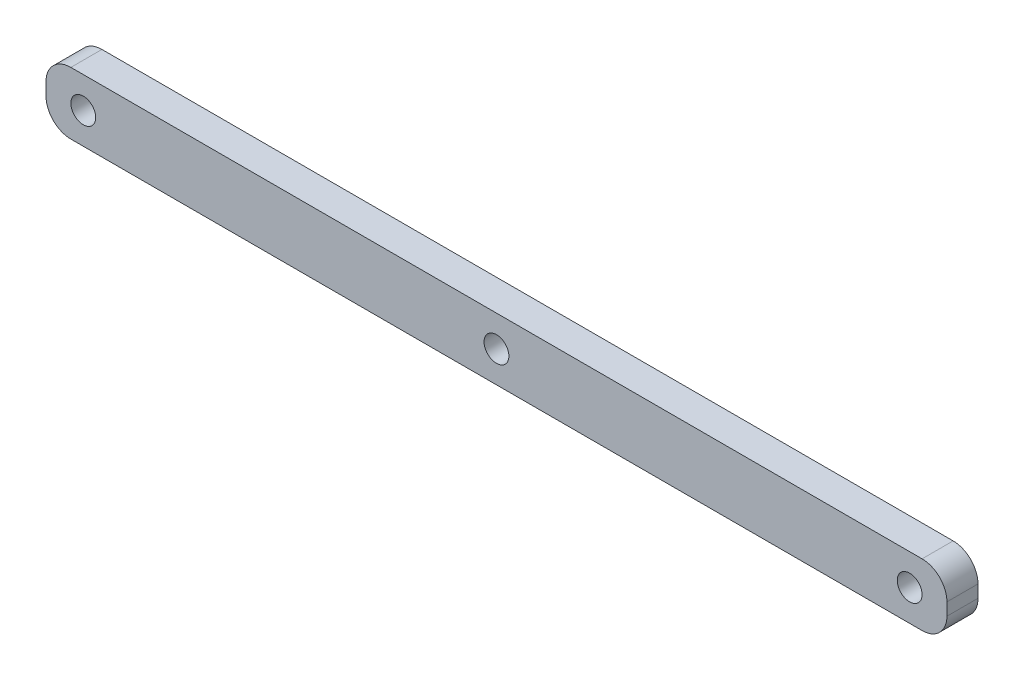
ISO-10303-21;
HEADER;
FILE_DESCRIPTION(('STEP AP214'),'2;1');
FILE_NAME('part.step','',(''),(''),'','','');
FILE_SCHEMA(('AUTOMOTIVE_DESIGN { 1 0 10303 214 1 1 1 1 }'));
ENDSEC;
DATA;
#1=APPLICATION_CONTEXT('core data for automotive mechanical design processes');
#2=APPLICATION_PROTOCOL_DEFINITION('international standard','automotive_design',2000,#1);
#3=PRODUCT_CONTEXT('',#1,'mechanical');
#4=PRODUCT('Part','Part','',(#3));
#5=PRODUCT_RELATED_PRODUCT_CATEGORY('part','',(#4));
#6=PRODUCT_DEFINITION_FORMATION('','',#4);
#7=PRODUCT_DEFINITION_CONTEXT('part definition',#1,'design');
#8=PRODUCT_DEFINITION('design','',#6,#7);
#9=PRODUCT_DEFINITION_SHAPE('','',#8);
#10=(LENGTH_UNIT() NAMED_UNIT(*) SI_UNIT(.MILLI.,.METRE.));
#11=(NAMED_UNIT(*) PLANE_ANGLE_UNIT() SI_UNIT($,.RADIAN.));
#12=(NAMED_UNIT(*) SI_UNIT($,.STERADIAN.) SOLID_ANGLE_UNIT());
#13=UNCERTAINTY_MEASURE_WITH_UNIT(LENGTH_MEASURE(1.E-05),#10,'distance_accuracy_value','');
#14=(GEOMETRIC_REPRESENTATION_CONTEXT(3) GLOBAL_UNCERTAINTY_ASSIGNED_CONTEXT((#13)) GLOBAL_UNIT_ASSIGNED_CONTEXT((#10,
#11,#12)) REPRESENTATION_CONTEXT('',''));
#15=CARTESIAN_POINT('',(0.,0.,0.));
#16=DIRECTION('',(0.,0.,1.));
#17=DIRECTION('',(1.,0.,0.));
#18=AXIS2_PLACEMENT_3D('',#15,#16,#17);
#19=CARTESIAN_POINT('',(72.5,5.,5.));
#20=DIRECTION('',(-1.,0.,0.));
#21=DIRECTION('',(0.,0.,1.));
#22=AXIS2_PLACEMENT_3D('',#19,#20,#21);
#23=PLANE('',#22);
#24=DIRECTION('',(0.,1.,0.));
#25=VECTOR('',#24,1.);
#26=CARTESIAN_POINT('',(72.5,5.,0.));
#27=LINE('',#26,#25);
#28=CARTESIAN_POINT('',(72.5,-1.,0.));
#29=VERTEX_POINT('',#28);
#30=CARTESIAN_POINT('',(72.5,1.,0.));
#31=VERTEX_POINT('',#30);
#32=EDGE_CURVE('E181',#29,#31,#27,.T.);
#33=ORIENTED_EDGE('',*,*,#32,.T.);
#34=DIRECTION('',(0.,0.,-1.));
#35=VECTOR('',#34,1.);
#36=CARTESIAN_POINT('',(72.5,1.,5.));
#37=LINE('',#36,#35);
#38=CARTESIAN_POINT('',(72.5,1.,5.));
#39=VERTEX_POINT('',#38);
#40=EDGE_CURVE('E11',#31,#39,#37,.F.);
#41=ORIENTED_EDGE('',*,*,#40,.T.);
#42=DIRECTION('',(0.,1.,0.));
#43=VECTOR('',#42,1.);
#44=CARTESIAN_POINT('',(72.5,5.,5.));
#45=LINE('',#44,#43);
#46=CARTESIAN_POINT('',(72.5,-1.,5.));
#47=VERTEX_POINT('',#46);
#48=EDGE_CURVE('E142',#47,#39,#45,.T.);
#49=ORIENTED_EDGE('',*,*,#48,.F.);
#50=DIRECTION('',(0.,0.,-1.));
#51=VECTOR('',#50,1.);
#52=CARTESIAN_POINT('',(72.5,-1.,5.));
#53=LINE('',#52,#51);
#54=EDGE_CURVE('E47',#47,#29,#53,.T.);
#55=ORIENTED_EDGE('',*,*,#54,.T.);
#56=EDGE_LOOP('',(#33,#41,#49,#55));
#57=FACE_BOUND('',#56,.T.);
#58=ADVANCED_FACE('F39',(#57),#23,.F.);
#59=CARTESIAN_POINT('',(-72.5,5.,5.));
#60=DIRECTION('',(0.,-1.,0.));
#61=DIRECTION('',(0.,0.,-1.));
#62=AXIS2_PLACEMENT_3D('',#59,#60,#61);
#63=PLANE('',#62);
#64=DIRECTION('',(-1.,0.,0.));
#65=VECTOR('',#64,1.);
#66=CARTESIAN_POINT('',(-72.5,5.,0.));
#67=LINE('',#66,#65);
#68=CARTESIAN_POINT('',(68.5,5.,0.));
#69=VERTEX_POINT('',#68);
#70=CARTESIAN_POINT('',(-68.5,5.,0.));
#71=VERTEX_POINT('',#70);
#72=EDGE_CURVE('E148',#69,#71,#67,.T.);
#73=ORIENTED_EDGE('',*,*,#72,.T.);
#74=DIRECTION('',(0.,0.,-1.));
#75=VECTOR('',#74,1.);
#76=CARTESIAN_POINT('',(-68.5,5.,5.));
#77=LINE('',#76,#75);
#78=CARTESIAN_POINT('',(-68.5,5.,5.));
#79=VERTEX_POINT('',#78);
#80=EDGE_CURVE('E57',#71,#79,#77,.F.);
#81=ORIENTED_EDGE('',*,*,#80,.T.);
#82=DIRECTION('',(-1.,0.,0.));
#83=VECTOR('',#82,1.);
#84=CARTESIAN_POINT('',(-72.5,5.,5.));
#85=LINE('',#84,#83);
#86=CARTESIAN_POINT('',(68.5,5.,5.));
#87=VERTEX_POINT('',#86);
#88=EDGE_CURVE('E145',#87,#79,#85,.T.);
#89=ORIENTED_EDGE('',*,*,#88,.F.);
#90=DIRECTION('',(0.,0.,-1.));
#91=VECTOR('',#90,1.);
#92=CARTESIAN_POINT('',(68.5,5.,5.));
#93=LINE('',#92,#91);
#94=EDGE_CURVE('E172',#87,#69,#93,.T.);
#95=ORIENTED_EDGE('',*,*,#94,.T.);
#96=EDGE_LOOP('',(#73,#81,#89,#95));
#97=FACE_BOUND('',#96,.T.);
#98=ADVANCED_FACE('F234',(#97),#63,.F.);
#99=CARTESIAN_POINT('',(-72.5,5.,5.));
#100=DIRECTION('',(1.,0.,0.));
#101=DIRECTION('',(0.,0.,-1.));
#102=AXIS2_PLACEMENT_3D('',#99,#100,#101);
#103=PLANE('',#102);
#104=DIRECTION('',(0.,-1.,0.));
#105=VECTOR('',#104,1.);
#106=CARTESIAN_POINT('',(-72.5,5.,0.));
#107=LINE('',#106,#105);
#108=CARTESIAN_POINT('',(-72.5,1.,0.));
#109=VERTEX_POINT('',#108);
#110=CARTESIAN_POINT('',(-72.5,-1.,0.));
#111=VERTEX_POINT('',#110);
#112=EDGE_CURVE('E143',#109,#111,#107,.T.);
#113=ORIENTED_EDGE('',*,*,#112,.T.);
#114=DIRECTION('',(0.,0.,-1.));
#115=VECTOR('',#114,1.);
#116=CARTESIAN_POINT('',(-72.5,-1.,5.));
#117=LINE('',#116,#115);
#118=CARTESIAN_POINT('',(-72.5,-1.,5.));
#119=VERTEX_POINT('',#118);
#120=EDGE_CURVE('E118',#111,#119,#117,.F.);
#121=ORIENTED_EDGE('',*,*,#120,.T.);
#122=DIRECTION('',(0.,-1.,0.));
#123=VECTOR('',#122,1.);
#124=CARTESIAN_POINT('',(-72.5,5.,5.));
#125=LINE('',#124,#123);
#126=CARTESIAN_POINT('',(-72.5,1.,5.));
#127=VERTEX_POINT('',#126);
#128=EDGE_CURVE('E195',#127,#119,#125,.T.);
#129=ORIENTED_EDGE('',*,*,#128,.F.);
#130=DIRECTION('',(0.,0.,-1.));
#131=VECTOR('',#130,1.);
#132=CARTESIAN_POINT('',(-72.5,1.,5.));
#133=LINE('',#132,#131);
#134=EDGE_CURVE('E124',#127,#109,#133,.T.);
#135=ORIENTED_EDGE('',*,*,#134,.T.);
#136=EDGE_LOOP('',(#113,#121,#129,#135));
#137=FACE_BOUND('',#136,.T.);
#138=ADVANCED_FACE('F231',(#137),#103,.F.);
#139=CARTESIAN_POINT('',(-72.5,-5.,5.));
#140=DIRECTION('',(0.,1.,0.));
#141=DIRECTION('',(0.,0.,1.));
#142=AXIS2_PLACEMENT_3D('',#139,#140,#141);
#143=PLANE('',#142);
#144=DIRECTION('',(1.,0.,0.));
#145=VECTOR('',#144,1.);
#146=CARTESIAN_POINT('',(-72.5,-5.,5.));
#147=LINE('',#146,#145);
#148=CARTESIAN_POINT('',(-68.5,-5.,5.));
#149=VERTEX_POINT('',#148);
#150=CARTESIAN_POINT('',(68.5,-5.,5.));
#151=VERTEX_POINT('',#150);
#152=EDGE_CURVE('E134',#149,#151,#147,.T.);
#153=ORIENTED_EDGE('',*,*,#152,.F.);
#154=DIRECTION('',(0.,0.,-1.));
#155=VECTOR('',#154,1.);
#156=CARTESIAN_POINT('',(-68.5,-5.,5.));
#157=LINE('',#156,#155);
#158=CARTESIAN_POINT('',(-68.5,-5.,0.));
#159=VERTEX_POINT('',#158);
#160=EDGE_CURVE('E117',#149,#159,#157,.T.);
#161=ORIENTED_EDGE('',*,*,#160,.T.);
#162=DIRECTION('',(1.,0.,0.));
#163=VECTOR('',#162,1.);
#164=CARTESIAN_POINT('',(-72.5,-5.,0.));
#165=LINE('',#164,#163);
#166=CARTESIAN_POINT('',(68.5,-5.,0.));
#167=VERTEX_POINT('',#166);
#168=EDGE_CURVE('E131',#159,#167,#165,.T.);
#169=ORIENTED_EDGE('',*,*,#168,.T.);
#170=DIRECTION('',(0.,0.,-1.));
#171=VECTOR('',#170,1.);
#172=CARTESIAN_POINT('',(68.5,-5.,5.));
#173=LINE('',#172,#171);
#174=EDGE_CURVE('E137',#167,#151,#173,.F.);
#175=ORIENTED_EDGE('',*,*,#174,.T.);
#176=EDGE_LOOP('',(#153,#161,#169,#175));
#177=FACE_BOUND('',#176,.T.);
#178=ADVANCED_FACE('F130',(#177),#143,.F.);
#179=CARTESIAN_POINT('',(0.,0.,5.));
#180=DIRECTION('',(0.,0.,1.));
#181=DIRECTION('',(1.,0.,0.));
#182=AXIS2_PLACEMENT_3D('',#179,#180,#181);
#183=PLANE('',#182);
#184=CARTESIAN_POINT('',(0.,0.,5.));
#185=DIRECTION('',(0.,0.,1.));
#186=DIRECTION('',(1.,0.,0.));
#187=AXIS2_PLACEMENT_3D('',#184,#185,#186);
#188=CIRCLE('',#187,1.99999999999999);
#189=CARTESIAN_POINT('',(1.99999999999999,0.,5.));
#190=VERTEX_POINT('',#189);
#191=EDGE_CURVE('E214',#190,#190,#188,.T.);
#192=ORIENTED_EDGE('',*,*,#191,.F.);
#193=EDGE_LOOP('',(#192));
#194=FACE_BOUND('',#193,.T.);
#195=CARTESIAN_POINT('',(-66.5,0.,5.));
#196=DIRECTION('',(0.,0.,1.));
#197=DIRECTION('',(1.,0.,0.));
#198=AXIS2_PLACEMENT_3D('',#195,#196,#197);
#199=CIRCLE('',#198,1.99999999999999);
#200=CARTESIAN_POINT('',(-64.5,0.,5.));
#201=VERTEX_POINT('',#200);
#202=EDGE_CURVE('E207',#201,#201,#199,.T.);
#203=ORIENTED_EDGE('',*,*,#202,.F.);
#204=EDGE_LOOP('',(#203));
#205=FACE_BOUND('',#204,.T.);
#206=CARTESIAN_POINT('',(66.5,0.,5.));
#207=DIRECTION('',(0.,0.,1.));
#208=DIRECTION('',(1.,0.,0.));
#209=AXIS2_PLACEMENT_3D('',#206,#207,#208);
#210=CIRCLE('',#209,1.99999999999999);
#211=CARTESIAN_POINT('',(68.5,0.,5.));
#212=VERTEX_POINT('',#211);
#213=EDGE_CURVE('E190',#212,#212,#210,.T.);
#214=ORIENTED_EDGE('',*,*,#213,.F.);
#215=EDGE_LOOP('',(#214));
#216=FACE_BOUND('',#215,.T.);
#217=ORIENTED_EDGE('',*,*,#128,.T.);
#218=CARTESIAN_POINT('',(-68.5,-1.,5.));
#219=DIRECTION('',(0.,0.,1.));
#220=DIRECTION('',(1.,0.,0.));
#221=AXIS2_PLACEMENT_3D('',#218,#219,#220);
#222=CIRCLE('',#221,4.);
#223=EDGE_CURVE('E169',#119,#149,#222,.T.);
#224=ORIENTED_EDGE('',*,*,#223,.T.);
#225=ORIENTED_EDGE('',*,*,#152,.T.);
#226=CARTESIAN_POINT('',(68.5,-1.,5.));
#227=DIRECTION('',(0.,0.,1.));
#228=DIRECTION('',(1.,0.,0.));
#229=AXIS2_PLACEMENT_3D('',#226,#227,#228);
#230=CIRCLE('',#229,4.);
#231=EDGE_CURVE('E163',#151,#47,#230,.T.);
#232=ORIENTED_EDGE('',*,*,#231,.T.);
#233=ORIENTED_EDGE('',*,*,#48,.T.);
#234=CARTESIAN_POINT('',(68.5,1.,5.));
#235=DIRECTION('',(0.,0.,1.));
#236=DIRECTION('',(1.,0.,0.));
#237=AXIS2_PLACEMENT_3D('',#234,#235,#236);
#238=CIRCLE('',#237,4.);
#239=EDGE_CURVE('E64',#39,#87,#238,.T.);
#240=ORIENTED_EDGE('',*,*,#239,.T.);
#241=ORIENTED_EDGE('',*,*,#88,.T.);
#242=CARTESIAN_POINT('',(-68.5,1.,5.));
#243=DIRECTION('',(0.,0.,1.));
#244=DIRECTION('',(1.,0.,0.));
#245=AXIS2_PLACEMENT_3D('',#242,#243,#244);
#246=CIRCLE('',#245,4.);
#247=EDGE_CURVE('E166',#79,#127,#246,.T.);
#248=ORIENTED_EDGE('',*,*,#247,.T.);
#249=EDGE_LOOP('',(#217,#224,#225,#232,#233,#240,#241,#248));
#250=FACE_BOUND('',#249,.T.);
#251=ADVANCED_FACE('F220',(#194,#205,#216,#250),#183,.T.);
#252=CARTESIAN_POINT('',(0.,0.,0.));
#253=DIRECTION('',(0.,0.,1.));
#254=DIRECTION('',(1.,0.,0.));
#255=AXIS2_PLACEMENT_3D('',#252,#253,#254);
#256=PLANE('',#255);
#257=CARTESIAN_POINT('',(0.,0.,0.));
#258=DIRECTION('',(0.,0.,1.));
#259=DIRECTION('',(1.,0.,0.));
#260=AXIS2_PLACEMENT_3D('',#257,#258,#259);
#261=CIRCLE('',#260,2.);
#262=CARTESIAN_POINT('',(2.,0.,0.));
#263=VERTEX_POINT('',#262);
#264=EDGE_CURVE('E211',#263,#263,#261,.T.);
#265=ORIENTED_EDGE('',*,*,#264,.T.);
#266=EDGE_LOOP('',(#265));
#267=FACE_BOUND('',#266,.T.);
#268=CARTESIAN_POINT('',(-66.5,0.,0.));
#269=DIRECTION('',(0.,0.,1.));
#270=DIRECTION('',(1.,0.,0.));
#271=AXIS2_PLACEMENT_3D('',#268,#269,#270);
#272=CIRCLE('',#271,2.);
#273=CARTESIAN_POINT('',(-64.5,0.,0.));
#274=VERTEX_POINT('',#273);
#275=EDGE_CURVE('E203',#274,#274,#272,.T.);
#276=ORIENTED_EDGE('',*,*,#275,.T.);
#277=EDGE_LOOP('',(#276));
#278=FACE_BOUND('',#277,.T.);
#279=CARTESIAN_POINT('',(66.5,0.,0.));
#280=DIRECTION('',(0.,0.,1.));
#281=DIRECTION('',(1.,0.,0.));
#282=AXIS2_PLACEMENT_3D('',#279,#280,#281);
#283=CIRCLE('',#282,2.);
#284=CARTESIAN_POINT('',(68.5,0.,0.));
#285=VERTEX_POINT('',#284);
#286=EDGE_CURVE('E186',#285,#285,#283,.T.);
#287=ORIENTED_EDGE('',*,*,#286,.T.);
#288=EDGE_LOOP('',(#287));
#289=FACE_BOUND('',#288,.T.);
#290=ORIENTED_EDGE('',*,*,#168,.F.);
#291=CARTESIAN_POINT('',(-68.5,-1.,0.));
#292=DIRECTION('',(0.,0.,1.));
#293=DIRECTION('',(1.,0.,0.));
#294=AXIS2_PLACEMENT_3D('',#291,#292,#293);
#295=CIRCLE('',#294,4.);
#296=EDGE_CURVE('E113',#159,#111,#295,.F.);
#297=ORIENTED_EDGE('',*,*,#296,.T.);
#298=ORIENTED_EDGE('',*,*,#112,.F.);
#299=CARTESIAN_POINT('',(-68.5,1.,0.));
#300=DIRECTION('',(0.,0.,1.));
#301=DIRECTION('',(1.,0.,0.));
#302=AXIS2_PLACEMENT_3D('',#299,#300,#301);
#303=CIRCLE('',#302,4.);
#304=EDGE_CURVE('E125',#109,#71,#303,.F.);
#305=ORIENTED_EDGE('',*,*,#304,.T.);
#306=ORIENTED_EDGE('',*,*,#72,.F.);
#307=CARTESIAN_POINT('',(68.5,1.,0.));
#308=DIRECTION('',(0.,0.,1.));
#309=DIRECTION('',(1.,0.,0.));
#310=AXIS2_PLACEMENT_3D('',#307,#308,#309);
#311=CIRCLE('',#310,4.);
#312=EDGE_CURVE('E154',#69,#31,#311,.F.);
#313=ORIENTED_EDGE('',*,*,#312,.T.);
#314=ORIENTED_EDGE('',*,*,#32,.F.);
#315=CARTESIAN_POINT('',(68.5,-1.,0.));
#316=DIRECTION('',(0.,0.,1.));
#317=DIRECTION('',(1.,0.,0.));
#318=AXIS2_PLACEMENT_3D('',#315,#316,#317);
#319=CIRCLE('',#318,4.);
#320=EDGE_CURVE('E136',#29,#167,#319,.F.);
#321=ORIENTED_EDGE('',*,*,#320,.T.);
#322=EDGE_LOOP('',(#290,#297,#298,#305,#306,#313,#314,#321));
#323=FACE_BOUND('',#322,.T.);
#324=ADVANCED_FACE('F139',(#267,#278,#289,#323),#256,.F.);
#325=CARTESIAN_POINT('',(66.5,0.,5.));
#326=DIRECTION('',(0.,0.,1.));
#327=DIRECTION('',(1.,0.,0.));
#328=AXIS2_PLACEMENT_3D('',#325,#326,#327);
#329=CYLINDRICAL_SURFACE('',#328,1.99999999999999);
#330=ORIENTED_EDGE('',*,*,#286,.F.);
#331=EDGE_LOOP('',(#330));
#332=FACE_BOUND('',#331,.T.);
#333=ORIENTED_EDGE('',*,*,#213,.T.);
#334=EDGE_LOOP('',(#333));
#335=FACE_BOUND('',#334,.T.);
#336=ADVANCED_FACE('F292',(#332,#335),#329,.F.);
#337=CARTESIAN_POINT('',(-66.5,0.,5.));
#338=DIRECTION('',(0.,0.,1.));
#339=DIRECTION('',(1.,0.,0.));
#340=AXIS2_PLACEMENT_3D('',#337,#338,#339);
#341=CYLINDRICAL_SURFACE('',#340,1.99999999999999);
#342=ORIENTED_EDGE('',*,*,#275,.F.);
#343=EDGE_LOOP('',(#342));
#344=FACE_BOUND('',#343,.T.);
#345=ORIENTED_EDGE('',*,*,#202,.T.);
#346=EDGE_LOOP('',(#345));
#347=FACE_BOUND('',#346,.T.);
#348=ADVANCED_FACE('F283',(#344,#347),#341,.F.);
#349=CARTESIAN_POINT('',(0.,0.,5.));
#350=DIRECTION('',(0.,0.,1.));
#351=DIRECTION('',(1.,0.,0.));
#352=AXIS2_PLACEMENT_3D('',#349,#350,#351);
#353=CYLINDRICAL_SURFACE('',#352,1.99999999999999);
#354=ORIENTED_EDGE('',*,*,#264,.F.);
#355=EDGE_LOOP('',(#354));
#356=FACE_BOUND('',#355,.T.);
#357=ORIENTED_EDGE('',*,*,#191,.T.);
#358=EDGE_LOOP('',(#357));
#359=FACE_BOUND('',#358,.T.);
#360=ADVANCED_FACE('F218',(#356,#359),#353,.F.);
#361=CARTESIAN_POINT('',(-68.5,-1.,5.));
#362=DIRECTION('',(0.,0.,-1.));
#363=DIRECTION('',(-1.,0.,0.));
#364=AXIS2_PLACEMENT_3D('',#361,#362,#363);
#365=CYLINDRICAL_SURFACE('',#364,4.);
#366=ORIENTED_EDGE('',*,*,#223,.F.);
#367=ORIENTED_EDGE('',*,*,#120,.F.);
#368=ORIENTED_EDGE('',*,*,#296,.F.);
#369=ORIENTED_EDGE('',*,*,#160,.F.);
#370=EDGE_LOOP('',(#366,#367,#368,#369));
#371=FACE_BOUND('',#370,.T.);
#372=ADVANCED_FACE('F116',(#371),#365,.T.);
#373=CARTESIAN_POINT('',(-68.5,1.,5.));
#374=DIRECTION('',(0.,0.,-1.));
#375=DIRECTION('',(-1.,0.,0.));
#376=AXIS2_PLACEMENT_3D('',#373,#374,#375);
#377=CYLINDRICAL_SURFACE('',#376,4.);
#378=ORIENTED_EDGE('',*,*,#247,.F.);
#379=ORIENTED_EDGE('',*,*,#80,.F.);
#380=ORIENTED_EDGE('',*,*,#304,.F.);
#381=ORIENTED_EDGE('',*,*,#134,.F.);
#382=EDGE_LOOP('',(#378,#379,#380,#381));
#383=FACE_BOUND('',#382,.T.);
#384=ADVANCED_FACE('F233',(#383),#377,.T.);
#385=CARTESIAN_POINT('',(68.5,1.,5.));
#386=DIRECTION('',(0.,0.,-1.));
#387=DIRECTION('',(-1.,0.,0.));
#388=AXIS2_PLACEMENT_3D('',#385,#386,#387);
#389=CYLINDRICAL_SURFACE('',#388,4.);
#390=ORIENTED_EDGE('',*,*,#239,.F.);
#391=ORIENTED_EDGE('',*,*,#40,.F.);
#392=ORIENTED_EDGE('',*,*,#312,.F.);
#393=ORIENTED_EDGE('',*,*,#94,.F.);
#394=EDGE_LOOP('',(#390,#391,#392,#393));
#395=FACE_BOUND('',#394,.T.);
#396=ADVANCED_FACE('F237',(#395),#389,.T.);
#397=CARTESIAN_POINT('',(68.5,-1.,5.));
#398=DIRECTION('',(0.,0.,-1.));
#399=DIRECTION('',(-1.,0.,0.));
#400=AXIS2_PLACEMENT_3D('',#397,#398,#399);
#401=CYLINDRICAL_SURFACE('',#400,4.);
#402=ORIENTED_EDGE('',*,*,#231,.F.);
#403=ORIENTED_EDGE('',*,*,#174,.F.);
#404=ORIENTED_EDGE('',*,*,#320,.F.);
#405=ORIENTED_EDGE('',*,*,#54,.F.);
#406=EDGE_LOOP('',(#402,#403,#404,#405));
#407=FACE_BOUND('',#406,.T.);
#408=ADVANCED_FACE('F41',(#407),#401,.T.);
#409=CLOSED_SHELL('',(#58,#98,#138,#178,#251,#324,#336,#348,#360,#372,#384,#396,#408));
#410=MANIFOLD_SOLID_BREP('B2',#409);
#411=ADVANCED_BREP_SHAPE_REPRESENTATION('',(#18,#410),#14);
#412=SHAPE_DEFINITION_REPRESENTATION(#9,#411);
ENDSEC;
END-ISO-10303-21;
